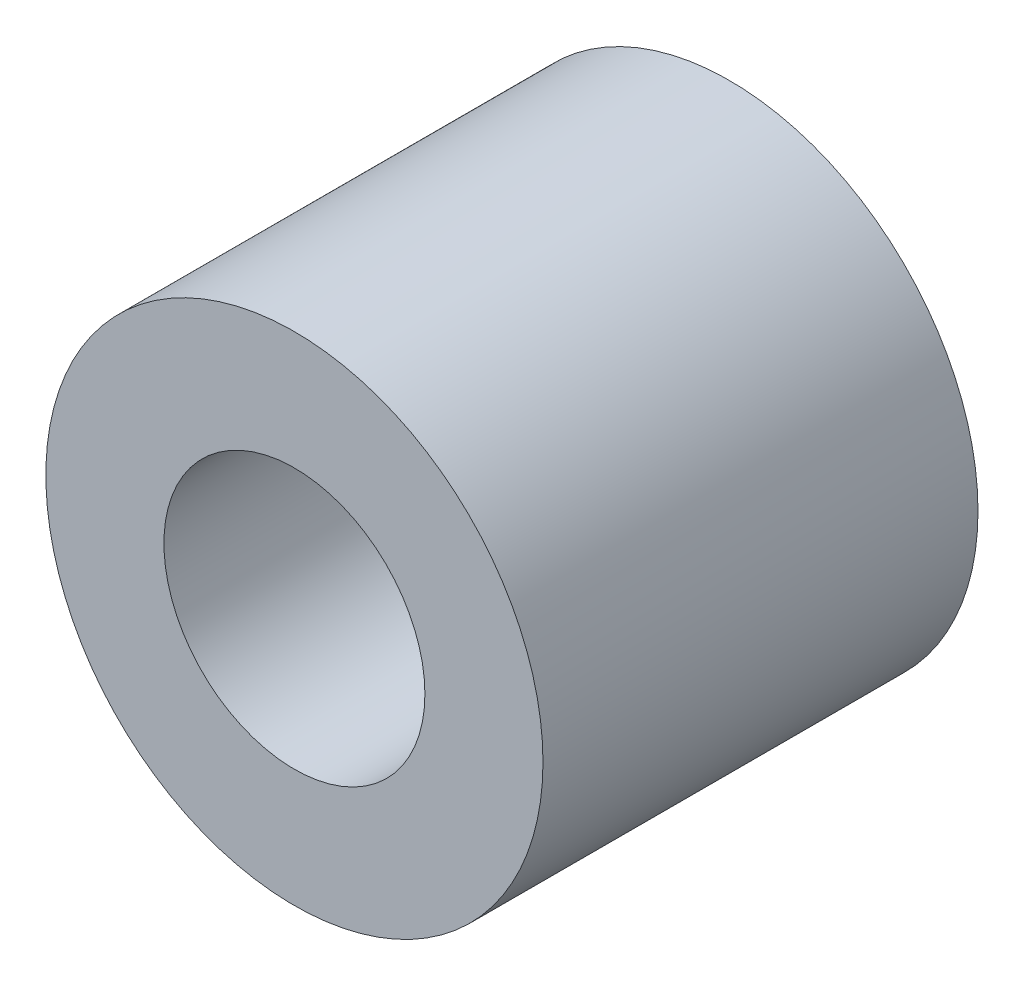
ISO-10303-21;
HEADER;
FILE_DESCRIPTION(('STEP AP214'),'2;1');
FILE_NAME('part.step','',(''),(''),'','','');
FILE_SCHEMA(('AUTOMOTIVE_DESIGN { 1 0 10303 214 1 1 1 1 }'));
ENDSEC;
DATA;
#1=APPLICATION_CONTEXT('core data for automotive mechanical design processes');
#2=APPLICATION_PROTOCOL_DEFINITION('international standard','automotive_design',2000,#1);
#3=PRODUCT_CONTEXT('',#1,'mechanical');
#4=PRODUCT('Part','Part','',(#3));
#5=PRODUCT_RELATED_PRODUCT_CATEGORY('part','',(#4));
#6=PRODUCT_DEFINITION_FORMATION('','',#4);
#7=PRODUCT_DEFINITION_CONTEXT('part definition',#1,'design');
#8=PRODUCT_DEFINITION('design','',#6,#7);
#9=PRODUCT_DEFINITION_SHAPE('','',#8);
#10=(LENGTH_UNIT() NAMED_UNIT(*) SI_UNIT(.MILLI.,.METRE.));
#11=(NAMED_UNIT(*) PLANE_ANGLE_UNIT() SI_UNIT($,.RADIAN.));
#12=(NAMED_UNIT(*) SI_UNIT($,.STERADIAN.) SOLID_ANGLE_UNIT());
#13=UNCERTAINTY_MEASURE_WITH_UNIT(LENGTH_MEASURE(1.E-05),#10,'distance_accuracy_value','');
#14=(GEOMETRIC_REPRESENTATION_CONTEXT(3) GLOBAL_UNCERTAINTY_ASSIGNED_CONTEXT((#13)) GLOBAL_UNIT_ASSIGNED_CONTEXT((#10,
#11,#12)) REPRESENTATION_CONTEXT('',''));
#15=CARTESIAN_POINT('',(0.,0.,0.));
#16=DIRECTION('',(0.,0.,1.));
#17=DIRECTION('',(1.,0.,0.));
#18=AXIS2_PLACEMENT_3D('',#15,#16,#17);
#19=CARTESIAN_POINT('',(0.,0.,7.));
#20=DIRECTION('',(0.,0.,-1.));
#21=DIRECTION('',(-1.,0.,0.));
#22=AXIS2_PLACEMENT_3D('',#19,#20,#21);
#23=CYLINDRICAL_SURFACE('',#22,4.);
#24=CARTESIAN_POINT('',(0.,0.,7.));
#25=DIRECTION('',(0.,0.,1.));
#26=DIRECTION('',(1.,0.,0.));
#27=AXIS2_PLACEMENT_3D('',#24,#25,#26);
#28=CIRCLE('',#27,4.);
#29=CARTESIAN_POINT('',(4.,0.,7.));
#30=VERTEX_POINT('',#29);
#31=EDGE_CURVE('E10',#30,#30,#28,.T.);
#32=ORIENTED_EDGE('',*,*,#31,.F.);
#33=EDGE_LOOP('',(#32));
#34=FACE_BOUND('',#33,.T.);
#35=CARTESIAN_POINT('',(0.,0.,0.));
#36=DIRECTION('',(0.,0.,1.));
#37=DIRECTION('',(1.,0.,0.));
#38=AXIS2_PLACEMENT_3D('',#35,#36,#37);
#39=CIRCLE('',#38,4.);
#40=CARTESIAN_POINT('',(4.,0.,0.));
#41=VERTEX_POINT('',#40);
#42=EDGE_CURVE('E34',#41,#41,#39,.T.);
#43=ORIENTED_EDGE('',*,*,#42,.T.);
#44=EDGE_LOOP('',(#43));
#45=FACE_BOUND('',#44,.T.);
#46=ADVANCED_FACE('F31',(#34,#45),#23,.T.);
#47=CARTESIAN_POINT('',(0.,0.,7.));
#48=DIRECTION('',(0.,0.,1.));
#49=DIRECTION('',(1.,0.,0.));
#50=AXIS2_PLACEMENT_3D('',#47,#48,#49);
#51=PLANE('',#50);
#52=CARTESIAN_POINT('',(0.,0.,7.));
#53=DIRECTION('',(0.,0.,1.));
#54=DIRECTION('',(1.,0.,0.));
#55=AXIS2_PLACEMENT_3D('',#52,#53,#54);
#56=CIRCLE('',#55,2.1);
#57=CARTESIAN_POINT('',(2.1,0.,7.));
#58=VERTEX_POINT('',#57);
#59=EDGE_CURVE('E43',#58,#58,#56,.T.);
#60=ORIENTED_EDGE('',*,*,#59,.F.);
#61=EDGE_LOOP('',(#60));
#62=FACE_BOUND('',#61,.T.);
#63=ORIENTED_EDGE('',*,*,#31,.T.);
#64=EDGE_LOOP('',(#63));
#65=FACE_BOUND('',#64,.T.);
#66=ADVANCED_FACE('F58',(#62,#65),#51,.T.);
#67=CARTESIAN_POINT('',(0.,0.,0.));
#68=DIRECTION('',(0.,0.,1.));
#69=DIRECTION('',(1.,0.,0.));
#70=AXIS2_PLACEMENT_3D('',#67,#68,#69);
#71=PLANE('',#70);
#72=CARTESIAN_POINT('',(0.,0.,0.));
#73=DIRECTION('',(0.,0.,1.));
#74=DIRECTION('',(1.,0.,0.));
#75=AXIS2_PLACEMENT_3D('',#72,#73,#74);
#76=CIRCLE('',#75,2.1);
#77=CARTESIAN_POINT('',(2.1,0.,0.));
#78=VERTEX_POINT('',#77);
#79=EDGE_CURVE('E41',#78,#78,#76,.T.);
#80=ORIENTED_EDGE('',*,*,#79,.T.);
#81=EDGE_LOOP('',(#80));
#82=FACE_BOUND('',#81,.T.);
#83=ORIENTED_EDGE('',*,*,#42,.F.);
#84=EDGE_LOOP('',(#83));
#85=FACE_BOUND('',#84,.T.);
#86=ADVANCED_FACE('F49',(#82,#85),#71,.F.);
#87=CARTESIAN_POINT('',(0.,0.,0.));
#88=DIRECTION('',(0.,0.,1.));
#89=DIRECTION('',(1.,0.,0.));
#90=AXIS2_PLACEMENT_3D('',#87,#88,#89);
#91=CYLINDRICAL_SURFACE('',#90,2.1);
#92=ORIENTED_EDGE('',*,*,#79,.F.);
#93=EDGE_LOOP('',(#92));
#94=FACE_BOUND('',#93,.T.);
#95=ORIENTED_EDGE('',*,*,#59,.T.);
#96=EDGE_LOOP('',(#95));
#97=FACE_BOUND('',#96,.T.);
#98=ADVANCED_FACE('F52',(#94,#97),#91,.F.);
#99=CLOSED_SHELL('',(#46,#66,#86,#98));
#100=MANIFOLD_SOLID_BREP('B2',#99);
#101=ADVANCED_BREP_SHAPE_REPRESENTATION('',(#18,#100),#14);
#102=SHAPE_DEFINITION_REPRESENTATION(#9,#101);
ENDSEC;
END-ISO-10303-21;
